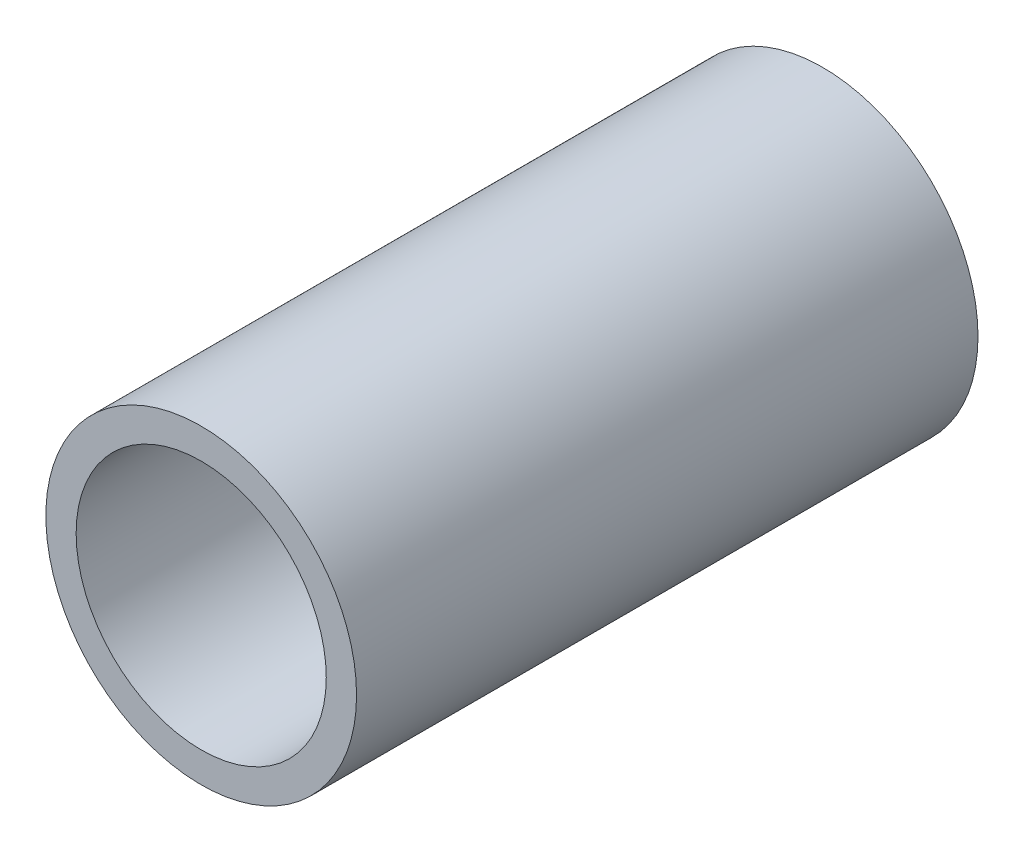
ISO-10303-21;
HEADER;
FILE_DESCRIPTION(('STEP AP214'),'2;1');
FILE_NAME('part.step','',(''),(''),'','','');
FILE_SCHEMA(('AUTOMOTIVE_DESIGN { 1 0 10303 214 1 1 1 1 }'));
ENDSEC;
DATA;
#1=APPLICATION_CONTEXT('core data for automotive mechanical design processes');
#2=APPLICATION_PROTOCOL_DEFINITION('international standard','automotive_design',2000,#1);
#3=PRODUCT_CONTEXT('',#1,'mechanical');
#4=PRODUCT('Part','Part','',(#3));
#5=PRODUCT_RELATED_PRODUCT_CATEGORY('part','',(#4));
#6=PRODUCT_DEFINITION_FORMATION('','',#4);
#7=PRODUCT_DEFINITION_CONTEXT('part definition',#1,'design');
#8=PRODUCT_DEFINITION('design','',#6,#7);
#9=PRODUCT_DEFINITION_SHAPE('','',#8);
#10=(LENGTH_UNIT() NAMED_UNIT(*) SI_UNIT(.MILLI.,.METRE.));
#11=(NAMED_UNIT(*) PLANE_ANGLE_UNIT() SI_UNIT($,.RADIAN.));
#12=(NAMED_UNIT(*) SI_UNIT($,.STERADIAN.) SOLID_ANGLE_UNIT());
#13=UNCERTAINTY_MEASURE_WITH_UNIT(LENGTH_MEASURE(1.E-05),#10,'distance_accuracy_value','');
#14=(GEOMETRIC_REPRESENTATION_CONTEXT(3) GLOBAL_UNCERTAINTY_ASSIGNED_CONTEXT((#13)) GLOBAL_UNIT_ASSIGNED_CONTEXT((#10,
#11,#12)) REPRESENTATION_CONTEXT('',''));
#15=CARTESIAN_POINT('',(0.,0.,0.));
#16=DIRECTION('',(0.,0.,1.));
#17=DIRECTION('',(1.,0.,0.));
#18=AXIS2_PLACEMENT_3D('',#15,#16,#17);
#19=CARTESIAN_POINT('',(0.,0.,20.));
#20=DIRECTION('',(0.,0.,1.));
#21=DIRECTION('',(1.,0.,0.));
#22=AXIS2_PLACEMENT_3D('',#19,#20,#21);
#23=PLANE('',#22);
#24=CARTESIAN_POINT('',(0.,0.,20.));
#25=DIRECTION('',(0.,0.,1.));
#26=DIRECTION('',(1.,0.,0.));
#27=AXIS2_PLACEMENT_3D('',#24,#25,#26);
#28=CIRCLE('',#27,5.);
#29=CARTESIAN_POINT('',(5.,0.,20.));
#30=VERTEX_POINT('',#29);
#31=EDGE_CURVE('E10',#30,#30,#28,.T.);
#32=ORIENTED_EDGE('',*,*,#31,.T.);
#33=EDGE_LOOP('',(#32));
#34=FACE_BOUND('',#33,.T.);
#35=CARTESIAN_POINT('',(0.,0.,20.));
#36=DIRECTION('',(0.,0.,1.));
#37=DIRECTION('',(1.,0.,0.));
#38=AXIS2_PLACEMENT_3D('',#35,#36,#37);
#39=CIRCLE('',#38,4.025);
#40=CARTESIAN_POINT('',(4.025,0.,20.));
#41=VERTEX_POINT('',#40);
#42=EDGE_CURVE('E41',#41,#41,#39,.T.);
#43=ORIENTED_EDGE('',*,*,#42,.F.);
#44=EDGE_LOOP('',(#43));
#45=FACE_BOUND('',#44,.T.);
#46=ADVANCED_FACE('F30',(#34,#45),#23,.T.);
#47=CARTESIAN_POINT('',(0.,0.,0.));
#48=DIRECTION('',(0.,0.,1.));
#49=DIRECTION('',(1.,0.,0.));
#50=AXIS2_PLACEMENT_3D('',#47,#48,#49);
#51=PLANE('',#50);
#52=CARTESIAN_POINT('',(0.,0.,0.));
#53=DIRECTION('',(0.,0.,1.));
#54=DIRECTION('',(1.,0.,0.));
#55=AXIS2_PLACEMENT_3D('',#52,#53,#54);
#56=CIRCLE('',#55,5.);
#57=CARTESIAN_POINT('',(5.,0.,0.));
#58=VERTEX_POINT('',#57);
#59=EDGE_CURVE('E34',#58,#58,#56,.T.);
#60=ORIENTED_EDGE('',*,*,#59,.F.);
#61=EDGE_LOOP('',(#60));
#62=FACE_BOUND('',#61,.T.);
#63=CARTESIAN_POINT('',(0.,0.,0.));
#64=DIRECTION('',(0.,0.,1.));
#65=DIRECTION('',(1.,0.,0.));
#66=AXIS2_PLACEMENT_3D('',#63,#64,#65);
#67=CIRCLE('',#66,4.025);
#68=CARTESIAN_POINT('',(4.025,0.,0.));
#69=VERTEX_POINT('',#68);
#70=EDGE_CURVE('E43',#69,#69,#67,.T.);
#71=ORIENTED_EDGE('',*,*,#70,.T.);
#72=EDGE_LOOP('',(#71));
#73=FACE_BOUND('',#72,.T.);
#74=ADVANCED_FACE('F53',(#62,#73),#51,.F.);
#75=CARTESIAN_POINT('',(0.,0.,20.));
#76=DIRECTION('',(0.,0.,-1.));
#77=DIRECTION('',(-1.,0.,0.));
#78=AXIS2_PLACEMENT_3D('',#75,#76,#77);
#79=CYLINDRICAL_SURFACE('',#78,5.);
#80=ORIENTED_EDGE('',*,*,#31,.F.);
#81=EDGE_LOOP('',(#80));
#82=FACE_BOUND('',#81,.T.);
#83=ORIENTED_EDGE('',*,*,#59,.T.);
#84=EDGE_LOOP('',(#83));
#85=FACE_BOUND('',#84,.T.);
#86=ADVANCED_FACE('F32',(#82,#85),#79,.T.);
#87=CARTESIAN_POINT('',(0.,0.,20.));
#88=DIRECTION('',(0.,0.,-1.));
#89=DIRECTION('',(-1.,0.,0.));
#90=AXIS2_PLACEMENT_3D('',#87,#88,#89);
#91=CYLINDRICAL_SURFACE('',#90,4.025);
#92=ORIENTED_EDGE('',*,*,#42,.T.);
#93=EDGE_LOOP('',(#92));
#94=FACE_BOUND('',#93,.T.);
#95=ORIENTED_EDGE('',*,*,#70,.F.);
#96=EDGE_LOOP('',(#95));
#97=FACE_BOUND('',#96,.T.);
#98=ADVANCED_FACE('F49',(#94,#97),#91,.F.);
#99=CLOSED_SHELL('',(#46,#74,#86,#98));
#100=MANIFOLD_SOLID_BREP('B2',#99);
#101=ADVANCED_BREP_SHAPE_REPRESENTATION('',(#18,#100),#14);
#102=SHAPE_DEFINITION_REPRESENTATION(#9,#101);
ENDSEC;
END-ISO-10303-21;
